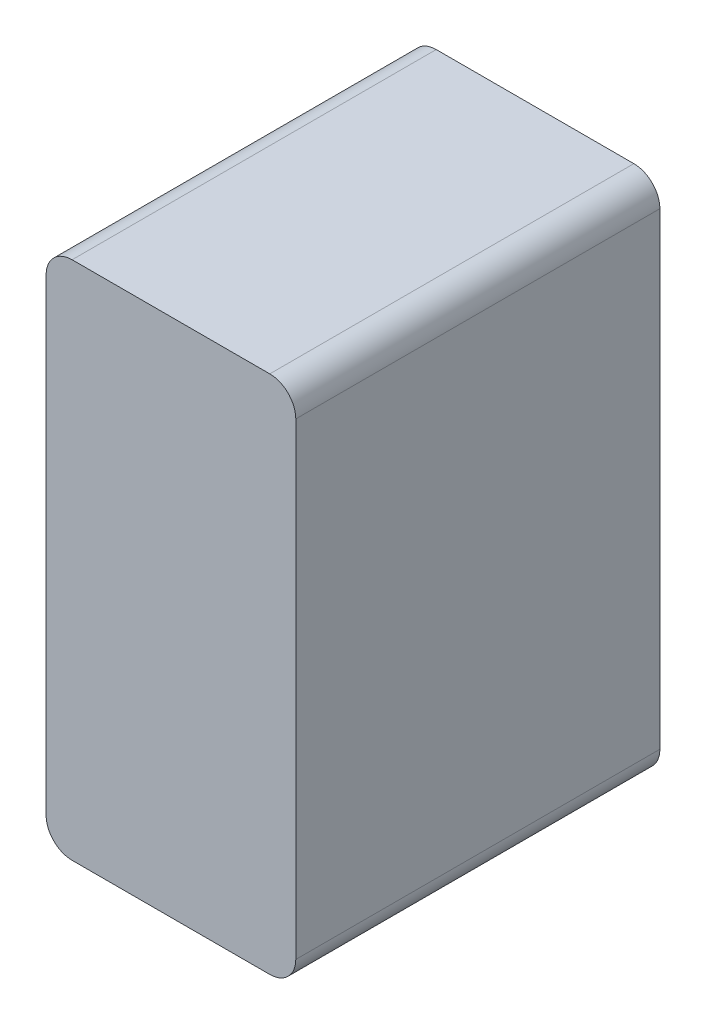
ISO-10303-21;
HEADER;
FILE_DESCRIPTION(('STEP AP214'),'2;1');
FILE_NAME('part.step','',(''),(''),'','','');
FILE_SCHEMA(('AUTOMOTIVE_DESIGN { 1 0 10303 214 1 1 1 1 }'));
ENDSEC;
DATA;
#1=APPLICATION_CONTEXT('core data for automotive mechanical design processes');
#2=APPLICATION_PROTOCOL_DEFINITION('international standard','automotive_design',2000,#1);
#3=PRODUCT_CONTEXT('',#1,'mechanical');
#4=PRODUCT('Part','Part','',(#3));
#5=PRODUCT_RELATED_PRODUCT_CATEGORY('part','',(#4));
#6=PRODUCT_DEFINITION_FORMATION('','',#4);
#7=PRODUCT_DEFINITION_CONTEXT('part definition',#1,'design');
#8=PRODUCT_DEFINITION('design','',#6,#7);
#9=PRODUCT_DEFINITION_SHAPE('','',#8);
#10=(LENGTH_UNIT() NAMED_UNIT(*) SI_UNIT(.MILLI.,.METRE.));
#11=(NAMED_UNIT(*) PLANE_ANGLE_UNIT() SI_UNIT($,.RADIAN.));
#12=(NAMED_UNIT(*) SI_UNIT($,.STERADIAN.) SOLID_ANGLE_UNIT());
#13=UNCERTAINTY_MEASURE_WITH_UNIT(LENGTH_MEASURE(1.E-05),#10,'distance_accuracy_value','');
#14=(GEOMETRIC_REPRESENTATION_CONTEXT(3) GLOBAL_UNCERTAINTY_ASSIGNED_CONTEXT((#13)) GLOBAL_UNIT_ASSIGNED_CONTEXT((#10,
#11,#12)) REPRESENTATION_CONTEXT('',''));
#15=CARTESIAN_POINT('',(0.,0.,0.));
#16=DIRECTION('',(0.,0.,1.));
#17=DIRECTION('',(1.,0.,0.));
#18=AXIS2_PLACEMENT_3D('',#15,#16,#17);
#19=CARTESIAN_POINT('',(24.,50.,70.));
#20=DIRECTION('',(-1.,0.,0.));
#21=DIRECTION('',(0.,-1.,0.));
#22=AXIS2_PLACEMENT_3D('',#19,#20,#21);
#23=PLANE('',#22);
#24=DIRECTION('',(0.,1.,0.));
#25=VECTOR('',#24,1.);
#26=CARTESIAN_POINT('',(24.,50.,70.));
#27=LINE('',#26,#25);
#28=CARTESIAN_POINT('',(24.,-45.,70.));
#29=VERTEX_POINT('',#28);
#30=CARTESIAN_POINT('',(24.,45.,70.));
#31=VERTEX_POINT('',#30);
#32=EDGE_CURVE('E191',#29,#31,#27,.T.);
#33=ORIENTED_EDGE('',*,*,#32,.F.);
#34=DIRECTION('',(0.,0.,-1.));
#35=VECTOR('',#34,1.);
#36=CARTESIAN_POINT('',(24.,-45.,70.));
#37=LINE('',#36,#35);
#38=CARTESIAN_POINT('',(24.,-45.,0.));
#39=VERTEX_POINT('',#38);
#40=EDGE_CURVE('E262',#29,#39,#37,.T.);
#41=ORIENTED_EDGE('',*,*,#40,.T.);
#42=DIRECTION('',(0.,1.,0.));
#43=VECTOR('',#42,1.);
#44=CARTESIAN_POINT('',(24.,50.,0.));
#45=LINE('',#44,#43);
#46=CARTESIAN_POINT('',(24.,45.,0.));
#47=VERTEX_POINT('',#46);
#48=EDGE_CURVE('E202',#39,#47,#45,.T.);
#49=ORIENTED_EDGE('',*,*,#48,.T.);
#50=DIRECTION('',(0.,0.,-1.));
#51=VECTOR('',#50,1.);
#52=CARTESIAN_POINT('',(24.,45.,70.));
#53=LINE('',#52,#51);
#54=EDGE_CURVE('E260',#47,#31,#53,.F.);
#55=ORIENTED_EDGE('',*,*,#54,.T.);
#56=EDGE_LOOP('',(#33,#41,#49,#55));
#57=FACE_BOUND('',#56,.T.);
#58=ADVANCED_FACE('F39',(#57),#23,.F.);
#59=CARTESIAN_POINT('',(-24.,50.,70.));
#60=DIRECTION('',(0.,-1.,0.));
#61=DIRECTION('',(0.,0.,-1.));
#62=AXIS2_PLACEMENT_3D('',#59,#60,#61);
#63=PLANE('',#62);
#64=DIRECTION('',(-1.,0.,0.));
#65=VECTOR('',#64,1.);
#66=CARTESIAN_POINT('',(-24.,50.,0.));
#67=LINE('',#66,#65);
#68=CARTESIAN_POINT('',(19.,50.,0.));
#69=VERTEX_POINT('',#68);
#70=CARTESIAN_POINT('',(-19.,50.,0.));
#71=VERTEX_POINT('',#70);
#72=EDGE_CURVE('E205',#69,#71,#67,.T.);
#73=ORIENTED_EDGE('',*,*,#72,.T.);
#74=DIRECTION('',(0.,0.,-1.));
#75=VECTOR('',#74,1.);
#76=CARTESIAN_POINT('',(-19.,50.,70.));
#77=LINE('',#76,#75);
#78=CARTESIAN_POINT('',(-19.,50.,70.));
#79=VERTEX_POINT('',#78);
#80=EDGE_CURVE('E54',#71,#79,#77,.F.);
#81=ORIENTED_EDGE('',*,*,#80,.T.);
#82=DIRECTION('',(-1.,0.,0.));
#83=VECTOR('',#82,1.);
#84=CARTESIAN_POINT('',(-24.,50.,70.));
#85=LINE('',#84,#83);
#86=CARTESIAN_POINT('',(19.,50.,70.));
#87=VERTEX_POINT('',#86);
#88=EDGE_CURVE('E193',#87,#79,#85,.T.);
#89=ORIENTED_EDGE('',*,*,#88,.F.);
#90=DIRECTION('',(0.,0.,-1.));
#91=VECTOR('',#90,1.);
#92=CARTESIAN_POINT('',(19.,50.,70.));
#93=LINE('',#92,#91);
#94=EDGE_CURVE('E265',#87,#69,#93,.T.);
#95=ORIENTED_EDGE('',*,*,#94,.T.);
#96=EDGE_LOOP('',(#73,#81,#89,#95));
#97=FACE_BOUND('',#96,.T.);
#98=ADVANCED_FACE('F311',(#97),#63,.F.);
#99=CARTESIAN_POINT('',(-24.,50.,70.));
#100=DIRECTION('',(1.,0.,0.));
#101=DIRECTION('',(0.,1.,0.));
#102=AXIS2_PLACEMENT_3D('',#99,#100,#101);
#103=PLANE('',#102);
#104=DIRECTION('',(0.,-1.,0.));
#105=VECTOR('',#104,1.);
#106=CARTESIAN_POINT('',(-24.,50.,0.));
#107=LINE('',#106,#105);
#108=CARTESIAN_POINT('',(-24.,45.,0.));
#109=VERTEX_POINT('',#108);
#110=CARTESIAN_POINT('',(-24.,-45.,0.));
#111=VERTEX_POINT('',#110);
#112=EDGE_CURVE('E208',#109,#111,#107,.T.);
#113=ORIENTED_EDGE('',*,*,#112,.T.);
#114=DIRECTION('',(0.,0.,-1.));
#115=VECTOR('',#114,1.);
#116=CARTESIAN_POINT('',(-24.,-45.,70.));
#117=LINE('',#116,#115);
#118=CARTESIAN_POINT('',(-24.,-45.,70.));
#119=VERTEX_POINT('',#118);
#120=EDGE_CURVE('E251',#111,#119,#117,.F.);
#121=ORIENTED_EDGE('',*,*,#120,.T.);
#122=DIRECTION('',(0.,-1.,0.));
#123=VECTOR('',#122,1.);
#124=CARTESIAN_POINT('',(-24.,50.,70.));
#125=LINE('',#124,#123);
#126=CARTESIAN_POINT('',(-24.,45.,70.));
#127=VERTEX_POINT('',#126);
#128=EDGE_CURVE('E196',#127,#119,#125,.T.);
#129=ORIENTED_EDGE('',*,*,#128,.F.);
#130=DIRECTION('',(0.,0.,-1.));
#131=VECTOR('',#130,1.);
#132=CARTESIAN_POINT('',(-24.,45.,70.));
#133=LINE('',#132,#131);
#134=EDGE_CURVE('E248',#127,#109,#133,.T.);
#135=ORIENTED_EDGE('',*,*,#134,.T.);
#136=EDGE_LOOP('',(#113,#121,#129,#135));
#137=FACE_BOUND('',#136,.T.);
#138=ADVANCED_FACE('F317',(#137),#103,.F.);
#139=CARTESIAN_POINT('',(-24.,-50.,70.));
#140=DIRECTION('',(0.,1.,0.));
#141=DIRECTION('',(0.,0.,1.));
#142=AXIS2_PLACEMENT_3D('',#139,#140,#141);
#143=PLANE('',#142);
#144=DIRECTION('',(1.,0.,0.));
#145=VECTOR('',#144,1.);
#146=CARTESIAN_POINT('',(-24.,-50.,70.));
#147=LINE('',#146,#145);
#148=CARTESIAN_POINT('',(-19.,-50.,70.));
#149=VERTEX_POINT('',#148);
#150=CARTESIAN_POINT('',(19.,-50.,70.));
#151=VERTEX_POINT('',#150);
#152=EDGE_CURVE('E199',#149,#151,#147,.T.);
#153=ORIENTED_EDGE('',*,*,#152,.F.);
#154=DIRECTION('',(0.,0.,-1.));
#155=VECTOR('',#154,1.);
#156=CARTESIAN_POINT('',(-19.,-50.,70.));
#157=LINE('',#156,#155);
#158=CARTESIAN_POINT('',(-19.,-50.,0.));
#159=VERTEX_POINT('',#158);
#160=EDGE_CURVE('E237',#149,#159,#157,.T.);
#161=ORIENTED_EDGE('',*,*,#160,.T.);
#162=DIRECTION('',(1.,0.,0.));
#163=VECTOR('',#162,1.);
#164=CARTESIAN_POINT('',(-24.,-50.,0.));
#165=LINE('',#164,#163);
#166=CARTESIAN_POINT('',(19.,-50.,0.));
#167=VERTEX_POINT('',#166);
#168=EDGE_CURVE('E194',#159,#167,#165,.T.);
#169=ORIENTED_EDGE('',*,*,#168,.T.);
#170=DIRECTION('',(0.,0.,-1.));
#171=VECTOR('',#170,1.);
#172=CARTESIAN_POINT('',(19.,-50.,70.));
#173=LINE('',#172,#171);
#174=EDGE_CURVE('E235',#167,#151,#173,.F.);
#175=ORIENTED_EDGE('',*,*,#174,.T.);
#176=EDGE_LOOP('',(#153,#161,#169,#175));
#177=FACE_BOUND('',#176,.T.);
#178=ADVANCED_FACE('F323',(#177),#143,.F.);
#179=CARTESIAN_POINT('',(0.,0.,70.));
#180=DIRECTION('',(0.,0.,1.));
#181=DIRECTION('',(1.,0.,0.));
#182=AXIS2_PLACEMENT_3D('',#179,#180,#181);
#183=PLANE('',#182);
#184=ORIENTED_EDGE('',*,*,#128,.T.);
#185=CARTESIAN_POINT('',(-19.,-45.,70.));
#186=DIRECTION('',(0.,0.,1.));
#187=DIRECTION('',(1.,0.,0.));
#188=AXIS2_PLACEMENT_3D('',#185,#186,#187);
#189=CIRCLE('',#188,5.);
#190=EDGE_CURVE('E258',#119,#149,#189,.T.);
#191=ORIENTED_EDGE('',*,*,#190,.T.);
#192=ORIENTED_EDGE('',*,*,#152,.T.);
#193=CARTESIAN_POINT('',(19.,-45.,70.));
#194=DIRECTION('',(0.,0.,1.));
#195=DIRECTION('',(1.,0.,0.));
#196=AXIS2_PLACEMENT_3D('',#193,#194,#195);
#197=CIRCLE('',#196,5.);
#198=EDGE_CURVE('E256',#151,#29,#197,.T.);
#199=ORIENTED_EDGE('',*,*,#198,.T.);
#200=ORIENTED_EDGE('',*,*,#32,.T.);
#201=CARTESIAN_POINT('',(19.,45.,70.));
#202=DIRECTION('',(0.,0.,1.));
#203=DIRECTION('',(1.,0.,0.));
#204=AXIS2_PLACEMENT_3D('',#201,#202,#203);
#205=CIRCLE('',#204,5.);
#206=EDGE_CURVE('E61',#31,#87,#205,.T.);
#207=ORIENTED_EDGE('',*,*,#206,.T.);
#208=ORIENTED_EDGE('',*,*,#88,.T.);
#209=CARTESIAN_POINT('',(-19.,45.,70.));
#210=DIRECTION('',(0.,0.,1.));
#211=DIRECTION('',(1.,0.,0.));
#212=AXIS2_PLACEMENT_3D('',#209,#210,#211);
#213=CIRCLE('',#212,5.);
#214=EDGE_CURVE('E254',#79,#127,#213,.T.);
#215=ORIENTED_EDGE('',*,*,#214,.T.);
#216=EDGE_LOOP('',(#184,#191,#192,#199,#200,#207,#208,#215));
#217=FACE_BOUND('',#216,.T.);
#218=ADVANCED_FACE('F327',(#217),#183,.T.);
#219=CARTESIAN_POINT('',(0.,0.,0.));
#220=DIRECTION('',(0.,0.,1.));
#221=DIRECTION('',(1.,0.,0.));
#222=AXIS2_PLACEMENT_3D('',#219,#220,#221);
#223=PLANE('',#222);
#224=DIRECTION('',(1.,0.,0.));
#225=VECTOR('',#224,1.);
#226=CARTESIAN_POINT('',(22.,48.,0.));
#227=LINE('',#226,#225);
#228=CARTESIAN_POINT('',(-17.,48.,0.));
#229=VERTEX_POINT('',#228);
#230=CARTESIAN_POINT('',(17.,48.,0.));
#231=VERTEX_POINT('',#230);
#232=EDGE_CURVE('E169',#229,#231,#227,.T.);
#233=ORIENTED_EDGE('',*,*,#232,.F.);
#234=CARTESIAN_POINT('',(-17.,43.,0.));
#235=DIRECTION('',(0.,0.,1.));
#236=DIRECTION('',(1.,0.,0.));
#237=AXIS2_PLACEMENT_3D('',#234,#235,#236);
#238=CIRCLE('',#237,5.);
#239=CARTESIAN_POINT('',(-22.,43.,0.));
#240=VERTEX_POINT('',#239);
#241=EDGE_CURVE('E153',#229,#240,#238,.T.);
#242=ORIENTED_EDGE('',*,*,#241,.T.);
#243=DIRECTION('',(0.,1.,0.));
#244=VECTOR('',#243,1.);
#245=CARTESIAN_POINT('',(-22.,48.,0.));
#246=LINE('',#245,#244);
#247=CARTESIAN_POINT('',(-22.,-43.,0.));
#248=VERTEX_POINT('',#247);
#249=EDGE_CURVE('E180',#248,#240,#246,.T.);
#250=ORIENTED_EDGE('',*,*,#249,.F.);
#251=CARTESIAN_POINT('',(-17.,-43.,0.));
#252=DIRECTION('',(0.,0.,1.));
#253=DIRECTION('',(1.,0.,0.));
#254=AXIS2_PLACEMENT_3D('',#251,#252,#253);
#255=CIRCLE('',#254,5.);
#256=CARTESIAN_POINT('',(-17.,-48.,0.));
#257=VERTEX_POINT('',#256);
#258=EDGE_CURVE('E47',#248,#257,#255,.T.);
#259=ORIENTED_EDGE('',*,*,#258,.T.);
#260=DIRECTION('',(-1.,0.,0.));
#261=VECTOR('',#260,1.);
#262=CARTESIAN_POINT('',(22.,-48.,0.));
#263=LINE('',#262,#261);
#264=CARTESIAN_POINT('',(17.,-48.,0.));
#265=VERTEX_POINT('',#264);
#266=EDGE_CURVE('E183',#265,#257,#263,.T.);
#267=ORIENTED_EDGE('',*,*,#266,.F.);
#268=CARTESIAN_POINT('',(17.,-43.,0.));
#269=DIRECTION('',(0.,0.,1.));
#270=DIRECTION('',(1.,0.,0.));
#271=AXIS2_PLACEMENT_3D('',#268,#269,#270);
#272=CIRCLE('',#271,5.);
#273=CARTESIAN_POINT('',(22.,-43.,0.));
#274=VERTEX_POINT('',#273);
#275=EDGE_CURVE('E11',#265,#274,#272,.T.);
#276=ORIENTED_EDGE('',*,*,#275,.T.);
#277=DIRECTION('',(0.,-1.,0.));
#278=VECTOR('',#277,1.);
#279=CARTESIAN_POINT('',(22.,48.,0.));
#280=LINE('',#279,#278);
#281=CARTESIAN_POINT('',(22.,43.,0.));
#282=VERTEX_POINT('',#281);
#283=EDGE_CURVE('E179',#282,#274,#280,.T.);
#284=ORIENTED_EDGE('',*,*,#283,.F.);
#285=CARTESIAN_POINT('',(17.,43.,0.));
#286=DIRECTION('',(0.,0.,1.));
#287=DIRECTION('',(1.,0.,0.));
#288=AXIS2_PLACEMENT_3D('',#285,#286,#287);
#289=CIRCLE('',#288,5.);
#290=EDGE_CURVE('E163',#282,#231,#289,.T.);
#291=ORIENTED_EDGE('',*,*,#290,.T.);
#292=EDGE_LOOP('',(#233,#242,#250,#259,#267,#276,#284,#291));
#293=FACE_BOUND('',#292,.T.);
#294=ORIENTED_EDGE('',*,*,#168,.F.);
#295=CARTESIAN_POINT('',(-19.,-45.,0.));
#296=DIRECTION('',(0.,0.,1.));
#297=DIRECTION('',(1.,0.,0.));
#298=AXIS2_PLACEMENT_3D('',#295,#296,#297);
#299=CIRCLE('',#298,5.);
#300=EDGE_CURVE('E246',#159,#111,#299,.F.);
#301=ORIENTED_EDGE('',*,*,#300,.T.);
#302=ORIENTED_EDGE('',*,*,#112,.F.);
#303=CARTESIAN_POINT('',(-19.,45.,0.));
#304=DIRECTION('',(0.,0.,1.));
#305=DIRECTION('',(1.,0.,0.));
#306=AXIS2_PLACEMENT_3D('',#303,#304,#305);
#307=CIRCLE('',#306,5.);
#308=EDGE_CURVE('E242',#109,#71,#307,.F.);
#309=ORIENTED_EDGE('',*,*,#308,.T.);
#310=ORIENTED_EDGE('',*,*,#72,.F.);
#311=CARTESIAN_POINT('',(19.,45.,0.));
#312=DIRECTION('',(0.,0.,1.));
#313=DIRECTION('',(1.,0.,0.));
#314=AXIS2_PLACEMENT_3D('',#311,#312,#313);
#315=CIRCLE('',#314,5.);
#316=EDGE_CURVE('E240',#69,#47,#315,.F.);
#317=ORIENTED_EDGE('',*,*,#316,.T.);
#318=ORIENTED_EDGE('',*,*,#48,.F.);
#319=CARTESIAN_POINT('',(19.,-45.,0.));
#320=DIRECTION('',(0.,0.,1.));
#321=DIRECTION('',(1.,0.,0.));
#322=AXIS2_PLACEMENT_3D('',#319,#320,#321);
#323=CIRCLE('',#322,5.);
#324=EDGE_CURVE('E244',#39,#167,#323,.F.);
#325=ORIENTED_EDGE('',*,*,#324,.T.);
#326=EDGE_LOOP('',(#294,#301,#302,#309,#310,#317,#318,#325));
#327=FACE_BOUND('',#326,.T.);
#328=ADVANCED_FACE('F176',(#293,#327),#223,.F.);
#329=CARTESIAN_POINT('',(-22.,48.,68.));
#330=DIRECTION('',(-1.,0.,0.));
#331=DIRECTION('',(0.,-1.,0.));
#332=AXIS2_PLACEMENT_3D('',#329,#330,#331);
#333=PLANE('',#332);
#334=ORIENTED_EDGE('',*,*,#249,.T.);
#335=DIRECTION('',(0.,0.,-1.));
#336=VECTOR('',#335,1.);
#337=CARTESIAN_POINT('',(-22.,43.,68.));
#338=LINE('',#337,#336);
#339=CARTESIAN_POINT('',(-22.,43.,68.));
#340=VERTEX_POINT('',#339);
#341=EDGE_CURVE('E158',#240,#340,#338,.F.);
#342=ORIENTED_EDGE('',*,*,#341,.T.);
#343=DIRECTION('',(0.,1.,0.));
#344=VECTOR('',#343,1.);
#345=CARTESIAN_POINT('',(-22.,48.,68.));
#346=LINE('',#345,#344);
#347=CARTESIAN_POINT('',(-22.,-43.,68.));
#348=VERTEX_POINT('',#347);
#349=EDGE_CURVE('E190',#348,#340,#346,.T.);
#350=ORIENTED_EDGE('',*,*,#349,.F.);
#351=DIRECTION('',(0.,0.,-1.));
#352=VECTOR('',#351,1.);
#353=CARTESIAN_POINT('',(-22.,-43.,0.));
#354=LINE('',#353,#352);
#355=EDGE_CURVE('E173',#348,#248,#354,.T.);
#356=ORIENTED_EDGE('',*,*,#355,.T.);
#357=EDGE_LOOP('',(#334,#342,#350,#356));
#358=FACE_BOUND('',#357,.T.);
#359=ADVANCED_FACE('F285',(#358),#333,.F.);
#360=CARTESIAN_POINT('',(22.,-48.,68.));
#361=DIRECTION('',(0.,-1.,0.));
#362=DIRECTION('',(0.,0.,-1.));
#363=AXIS2_PLACEMENT_3D('',#360,#361,#362);
#364=PLANE('',#363);
#365=ORIENTED_EDGE('',*,*,#266,.T.);
#366=DIRECTION('',(0.,0.,-1.));
#367=VECTOR('',#366,1.);
#368=CARTESIAN_POINT('',(-17.,-48.,68.));
#369=LINE('',#368,#367);
#370=CARTESIAN_POINT('',(-17.,-48.,68.));
#371=VERTEX_POINT('',#370);
#372=EDGE_CURVE('E233',#257,#371,#369,.F.);
#373=ORIENTED_EDGE('',*,*,#372,.T.);
#374=DIRECTION('',(-1.,0.,0.));
#375=VECTOR('',#374,1.);
#376=CARTESIAN_POINT('',(22.,-48.,68.));
#377=LINE('',#376,#375);
#378=CARTESIAN_POINT('',(17.,-48.,68.));
#379=VERTEX_POINT('',#378);
#380=EDGE_CURVE('E206',#379,#371,#377,.T.);
#381=ORIENTED_EDGE('',*,*,#380,.F.);
#382=DIRECTION('',(0.,0.,-1.));
#383=VECTOR('',#382,1.);
#384=CARTESIAN_POINT('',(17.,-48.,0.));
#385=LINE('',#384,#383);
#386=EDGE_CURVE('E230',#379,#265,#385,.T.);
#387=ORIENTED_EDGE('',*,*,#386,.T.);
#388=EDGE_LOOP('',(#365,#373,#381,#387));
#389=FACE_BOUND('',#388,.T.);
#390=ADVANCED_FACE('F274',(#389),#364,.F.);
#391=CARTESIAN_POINT('',(22.,48.,68.));
#392=DIRECTION('',(1.,0.,0.));
#393=DIRECTION('',(0.,1.,0.));
#394=AXIS2_PLACEMENT_3D('',#391,#392,#393);
#395=PLANE('',#394);
#396=DIRECTION('',(0.,-1.,0.));
#397=VECTOR('',#396,1.);
#398=CARTESIAN_POINT('',(22.,48.,68.));
#399=LINE('',#398,#397);
#400=CARTESIAN_POINT('',(22.,43.,68.));
#401=VERTEX_POINT('',#400);
#402=CARTESIAN_POINT('',(22.,-43.,68.));
#403=VERTEX_POINT('',#402);
#404=EDGE_CURVE('E287',#401,#403,#399,.T.);
#405=ORIENTED_EDGE('',*,*,#404,.F.);
#406=DIRECTION('',(0.,0.,-1.));
#407=VECTOR('',#406,1.);
#408=CARTESIAN_POINT('',(22.,43.,0.));
#409=LINE('',#408,#407);
#410=EDGE_CURVE('E227',#401,#282,#409,.T.);
#411=ORIENTED_EDGE('',*,*,#410,.T.);
#412=ORIENTED_EDGE('',*,*,#283,.T.);
#413=DIRECTION('',(0.,0.,-1.));
#414=VECTOR('',#413,1.);
#415=CARTESIAN_POINT('',(22.,-43.,68.));
#416=LINE('',#415,#414);
#417=EDGE_CURVE('E225',#274,#403,#416,.F.);
#418=ORIENTED_EDGE('',*,*,#417,.T.);
#419=EDGE_LOOP('',(#405,#411,#412,#418));
#420=FACE_BOUND('',#419,.T.);
#421=ADVANCED_FACE('F299',(#420),#395,.F.);
#422=CARTESIAN_POINT('',(22.,48.,68.));
#423=DIRECTION('',(0.,1.,0.));
#424=DIRECTION('',(0.,0.,1.));
#425=AXIS2_PLACEMENT_3D('',#422,#423,#424);
#426=PLANE('',#425);
#427=DIRECTION('',(1.,0.,0.));
#428=VECTOR('',#427,1.);
#429=CARTESIAN_POINT('',(22.,48.,68.));
#430=LINE('',#429,#428);
#431=CARTESIAN_POINT('',(-17.,48.,68.));
#432=VERTEX_POINT('',#431);
#433=CARTESIAN_POINT('',(17.,48.,68.));
#434=VERTEX_POINT('',#433);
#435=EDGE_CURVE('E172',#432,#434,#430,.T.);
#436=ORIENTED_EDGE('',*,*,#435,.F.);
#437=DIRECTION('',(0.,0.,-1.));
#438=VECTOR('',#437,1.);
#439=CARTESIAN_POINT('',(-17.,48.,0.));
#440=LINE('',#439,#438);
#441=EDGE_CURVE('E157',#432,#229,#440,.T.);
#442=ORIENTED_EDGE('',*,*,#441,.T.);
#443=ORIENTED_EDGE('',*,*,#232,.T.);
#444=DIRECTION('',(0.,0.,-1.));
#445=VECTOR('',#444,1.);
#446=CARTESIAN_POINT('',(17.,48.,68.));
#447=LINE('',#446,#445);
#448=EDGE_CURVE('E174',#231,#434,#447,.F.);
#449=ORIENTED_EDGE('',*,*,#448,.T.);
#450=EDGE_LOOP('',(#436,#442,#443,#449));
#451=FACE_BOUND('',#450,.T.);
#452=ADVANCED_FACE('F168',(#451),#426,.F.);
#453=CARTESIAN_POINT('',(0.,0.,68.));
#454=DIRECTION('',(0.,0.,-1.));
#455=DIRECTION('',(-1.,0.,0.));
#456=AXIS2_PLACEMENT_3D('',#453,#454,#455);
#457=PLANE('',#456);
#458=ORIENTED_EDGE('',*,*,#349,.T.);
#459=CARTESIAN_POINT('',(-17.,43.,68.));
#460=DIRECTION('',(0.,0.,-1.));
#461=DIRECTION('',(-1.,0.,0.));
#462=AXIS2_PLACEMENT_3D('',#459,#460,#461);
#463=CIRCLE('',#462,5.);
#464=EDGE_CURVE('E223',#340,#432,#463,.T.);
#465=ORIENTED_EDGE('',*,*,#464,.T.);
#466=ORIENTED_EDGE('',*,*,#435,.T.);
#467=CARTESIAN_POINT('',(17.,43.,68.));
#468=DIRECTION('',(0.,0.,-1.));
#469=DIRECTION('',(-1.,0.,0.));
#470=AXIS2_PLACEMENT_3D('',#467,#468,#469);
#471=CIRCLE('',#470,5.);
#472=EDGE_CURVE('E221',#434,#401,#471,.T.);
#473=ORIENTED_EDGE('',*,*,#472,.T.);
#474=ORIENTED_EDGE('',*,*,#404,.T.);
#475=CARTESIAN_POINT('',(17.,-43.,68.));
#476=DIRECTION('',(0.,0.,-1.));
#477=DIRECTION('',(-1.,0.,0.));
#478=AXIS2_PLACEMENT_3D('',#475,#476,#477);
#479=CIRCLE('',#478,5.);
#480=EDGE_CURVE('E217',#403,#379,#479,.T.);
#481=ORIENTED_EDGE('',*,*,#480,.T.);
#482=ORIENTED_EDGE('',*,*,#380,.T.);
#483=CARTESIAN_POINT('',(-17.,-43.,68.));
#484=DIRECTION('',(0.,0.,-1.));
#485=DIRECTION('',(-1.,0.,0.));
#486=AXIS2_PLACEMENT_3D('',#483,#484,#485);
#487=CIRCLE('',#486,5.);
#488=EDGE_CURVE('E219',#371,#348,#487,.T.);
#489=ORIENTED_EDGE('',*,*,#488,.T.);
#490=EDGE_LOOP('',(#458,#465,#466,#473,#474,#481,#482,#489));
#491=FACE_BOUND('',#490,.T.);
#492=ADVANCED_FACE('F283',(#491),#457,.T.);
#493=CARTESIAN_POINT('',(-17.,43.,68.));
#494=DIRECTION('',(0.,0.,1.));
#495=DIRECTION('',(1.,0.,0.));
#496=AXIS2_PLACEMENT_3D('',#493,#494,#495);
#497=CYLINDRICAL_SURFACE('',#496,5.);
#498=ORIENTED_EDGE('',*,*,#464,.F.);
#499=ORIENTED_EDGE('',*,*,#341,.F.);
#500=ORIENTED_EDGE('',*,*,#241,.F.);
#501=ORIENTED_EDGE('',*,*,#441,.F.);
#502=EDGE_LOOP('',(#498,#499,#500,#501));
#503=FACE_BOUND('',#502,.T.);
#504=ADVANCED_FACE('F156',(#503),#497,.F.);
#505=CARTESIAN_POINT('',(17.,43.,68.));
#506=DIRECTION('',(0.,0.,1.));
#507=DIRECTION('',(1.,0.,0.));
#508=AXIS2_PLACEMENT_3D('',#505,#506,#507);
#509=CYLINDRICAL_SURFACE('',#508,5.);
#510=ORIENTED_EDGE('',*,*,#472,.F.);
#511=ORIENTED_EDGE('',*,*,#448,.F.);
#512=ORIENTED_EDGE('',*,*,#290,.F.);
#513=ORIENTED_EDGE('',*,*,#410,.F.);
#514=EDGE_LOOP('',(#510,#511,#512,#513));
#515=FACE_BOUND('',#514,.T.);
#516=ADVANCED_FACE('F301',(#515),#509,.F.);
#517=CARTESIAN_POINT('',(-17.,-43.,68.));
#518=DIRECTION('',(0.,0.,1.));
#519=DIRECTION('',(1.,0.,0.));
#520=AXIS2_PLACEMENT_3D('',#517,#518,#519);
#521=CYLINDRICAL_SURFACE('',#520,5.);
#522=ORIENTED_EDGE('',*,*,#488,.F.);
#523=ORIENTED_EDGE('',*,*,#372,.F.);
#524=ORIENTED_EDGE('',*,*,#258,.F.);
#525=ORIENTED_EDGE('',*,*,#355,.F.);
#526=EDGE_LOOP('',(#522,#523,#524,#525));
#527=FACE_BOUND('',#526,.T.);
#528=ADVANCED_FACE('F279',(#527),#521,.F.);
#529=CARTESIAN_POINT('',(17.,-43.,68.));
#530=DIRECTION('',(0.,0.,1.));
#531=DIRECTION('',(1.,0.,0.));
#532=AXIS2_PLACEMENT_3D('',#529,#530,#531);
#533=CYLINDRICAL_SURFACE('',#532,5.);
#534=ORIENTED_EDGE('',*,*,#480,.F.);
#535=ORIENTED_EDGE('',*,*,#417,.F.);
#536=ORIENTED_EDGE('',*,*,#275,.F.);
#537=ORIENTED_EDGE('',*,*,#386,.F.);
#538=EDGE_LOOP('',(#534,#535,#536,#537));
#539=FACE_BOUND('',#538,.T.);
#540=ADVANCED_FACE('F298',(#539),#533,.F.);
#541=CARTESIAN_POINT('',(-19.,-45.,70.));
#542=DIRECTION('',(0.,0.,-1.));
#543=DIRECTION('',(-1.,0.,0.));
#544=AXIS2_PLACEMENT_3D('',#541,#542,#543);
#545=CYLINDRICAL_SURFACE('',#544,5.);
#546=ORIENTED_EDGE('',*,*,#190,.F.);
#547=ORIENTED_EDGE('',*,*,#120,.F.);
#548=ORIENTED_EDGE('',*,*,#300,.F.);
#549=ORIENTED_EDGE('',*,*,#160,.F.);
#550=EDGE_LOOP('',(#546,#547,#548,#549));
#551=FACE_BOUND('',#550,.T.);
#552=ADVANCED_FACE('F372',(#551),#545,.T.);
#553=CARTESIAN_POINT('',(19.,-45.,70.));
#554=DIRECTION('',(0.,0.,-1.));
#555=DIRECTION('',(-1.,0.,0.));
#556=AXIS2_PLACEMENT_3D('',#553,#554,#555);
#557=CYLINDRICAL_SURFACE('',#556,5.);
#558=ORIENTED_EDGE('',*,*,#198,.F.);
#559=ORIENTED_EDGE('',*,*,#174,.F.);
#560=ORIENTED_EDGE('',*,*,#324,.F.);
#561=ORIENTED_EDGE('',*,*,#40,.F.);
#562=EDGE_LOOP('',(#558,#559,#560,#561));
#563=FACE_BOUND('',#562,.T.);
#564=ADVANCED_FACE('F382',(#563),#557,.T.);
#565=CARTESIAN_POINT('',(-19.,45.,70.));
#566=DIRECTION('',(0.,0.,-1.));
#567=DIRECTION('',(-1.,0.,0.));
#568=AXIS2_PLACEMENT_3D('',#565,#566,#567);
#569=CYLINDRICAL_SURFACE('',#568,5.);
#570=ORIENTED_EDGE('',*,*,#214,.F.);
#571=ORIENTED_EDGE('',*,*,#80,.F.);
#572=ORIENTED_EDGE('',*,*,#308,.F.);
#573=ORIENTED_EDGE('',*,*,#134,.F.);
#574=EDGE_LOOP('',(#570,#571,#572,#573));
#575=FACE_BOUND('',#574,.T.);
#576=ADVANCED_FACE('F393',(#575),#569,.T.);
#577=CARTESIAN_POINT('',(19.,45.,70.));
#578=DIRECTION('',(0.,0.,-1.));
#579=DIRECTION('',(-1.,0.,0.));
#580=AXIS2_PLACEMENT_3D('',#577,#578,#579);
#581=CYLINDRICAL_SURFACE('',#580,5.);
#582=ORIENTED_EDGE('',*,*,#206,.F.);
#583=ORIENTED_EDGE('',*,*,#54,.F.);
#584=ORIENTED_EDGE('',*,*,#316,.F.);
#585=ORIENTED_EDGE('',*,*,#94,.F.);
#586=EDGE_LOOP('',(#582,#583,#584,#585));
#587=FACE_BOUND('',#586,.T.);
#588=ADVANCED_FACE('F41',(#587),#581,.T.);
#589=CLOSED_SHELL('',(#58,#98,#138,#178,#218,#328,#359,#390,#421,#452,#492,#504,#516,#528,#540,
#552,#564,#576,#588));
#590=MANIFOLD_SOLID_BREP('B2',#589);
#591=ADVANCED_BREP_SHAPE_REPRESENTATION('',(#18,#590),#14);
#592=SHAPE_DEFINITION_REPRESENTATION(#9,#591);
ENDSEC;
END-ISO-10303-21;
